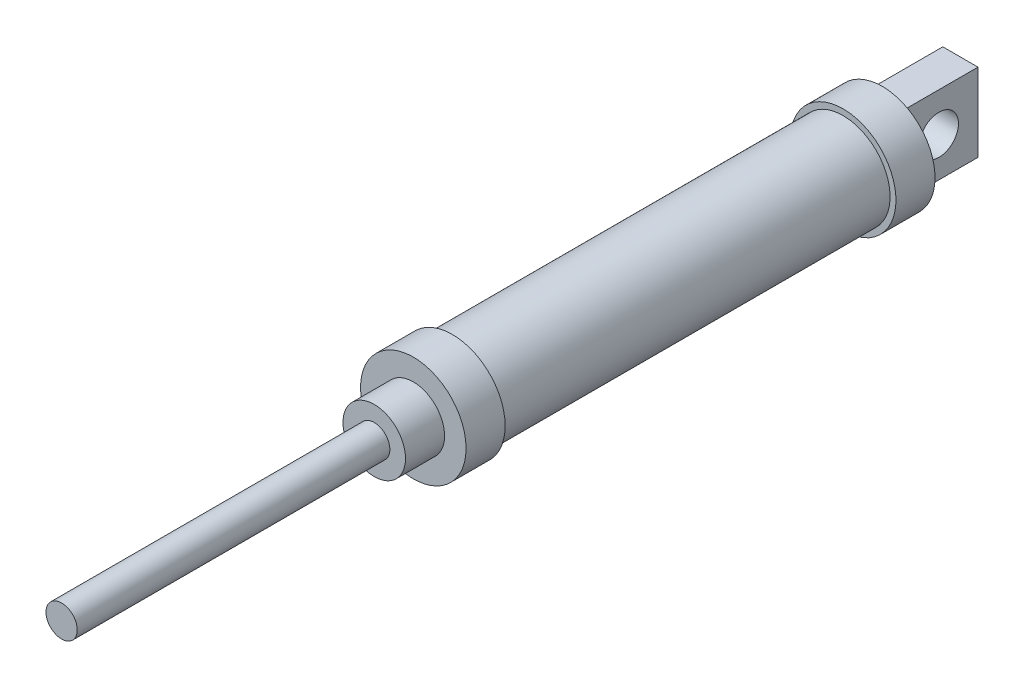
ISO-10303-21;
HEADER;
FILE_DESCRIPTION(('STEP AP214'),'2;1');
FILE_NAME('part.step','',(''),(''),'','','');
FILE_SCHEMA(('AUTOMOTIVE_DESIGN { 1 0 10303 214 1 1 1 1 }'));
ENDSEC;
DATA;
#1=APPLICATION_CONTEXT('core data for automotive mechanical design processes');
#2=APPLICATION_PROTOCOL_DEFINITION('international standard','automotive_design',2000,#1);
#3=PRODUCT_CONTEXT('',#1,'mechanical');
#4=PRODUCT('Part','Part','',(#3));
#5=PRODUCT_RELATED_PRODUCT_CATEGORY('part','',(#4));
#6=PRODUCT_DEFINITION_FORMATION('','',#4);
#7=PRODUCT_DEFINITION_CONTEXT('part definition',#1,'design');
#8=PRODUCT_DEFINITION('design','',#6,#7);
#9=PRODUCT_DEFINITION_SHAPE('','',#8);
#10=(LENGTH_UNIT() NAMED_UNIT(*) SI_UNIT(.MILLI.,.METRE.));
#11=(NAMED_UNIT(*) PLANE_ANGLE_UNIT() SI_UNIT($,.RADIAN.));
#12=(NAMED_UNIT(*) SI_UNIT($,.STERADIAN.) SOLID_ANGLE_UNIT());
#13=UNCERTAINTY_MEASURE_WITH_UNIT(LENGTH_MEASURE(1.E-05),#10,'distance_accuracy_value','');
#14=(GEOMETRIC_REPRESENTATION_CONTEXT(3) GLOBAL_UNCERTAINTY_ASSIGNED_CONTEXT((#13)) GLOBAL_UNIT_ASSIGNED_CONTEXT((#10,
#11,#12)) REPRESENTATION_CONTEXT('',''));
#15=CARTESIAN_POINT('',(0.,0.,0.));
#16=DIRECTION('',(0.,0.,1.));
#17=DIRECTION('',(1.,0.,0.));
#18=AXIS2_PLACEMENT_3D('',#15,#16,#17);
#19=CARTESIAN_POINT('',(0.,0.,10.));
#20=DIRECTION('',(0.,0.,-1.));
#21=DIRECTION('',(-1.,0.,0.));
#22=AXIS2_PLACEMENT_3D('',#19,#20,#21);
#23=CYLINDRICAL_SURFACE('',#22,13.5);
#24=CARTESIAN_POINT('',(0.,0.,10.));
#25=DIRECTION('',(0.,0.,1.));
#26=DIRECTION('',(1.,0.,0.));
#27=AXIS2_PLACEMENT_3D('',#24,#25,#26);
#28=CIRCLE('',#27,13.5);
#29=CARTESIAN_POINT('',(13.5,0.,10.));
#30=VERTEX_POINT('',#29);
#31=EDGE_CURVE('E120',#30,#30,#28,.T.);
#32=ORIENTED_EDGE('',*,*,#31,.F.);
#33=EDGE_LOOP('',(#32));
#34=FACE_BOUND('',#33,.T.);
#35=CARTESIAN_POINT('',(0.,0.,0.));
#36=DIRECTION('',(0.,0.,1.));
#37=DIRECTION('',(1.,0.,0.));
#38=AXIS2_PLACEMENT_3D('',#35,#36,#37);
#39=CIRCLE('',#38,13.5);
#40=CARTESIAN_POINT('',(13.5,0.,0.));
#41=VERTEX_POINT('',#40);
#42=EDGE_CURVE('E117',#41,#41,#39,.T.);
#43=ORIENTED_EDGE('',*,*,#42,.T.);
#44=EDGE_LOOP('',(#43));
#45=FACE_BOUND('',#44,.T.);
#46=ADVANCED_FACE('F35',(#34,#45),#23,.T.);
#47=CARTESIAN_POINT('',(0.,0.,10.));
#48=DIRECTION('',(0.,0.,1.));
#49=DIRECTION('',(1.,0.,0.));
#50=AXIS2_PLACEMENT_3D('',#47,#48,#49);
#51=PLANE('',#50);
#52=CARTESIAN_POINT('',(0.,0.,10.));
#53=DIRECTION('',(0.,0.,1.));
#54=DIRECTION('',(1.,0.,0.));
#55=AXIS2_PLACEMENT_3D('',#52,#53,#54);
#56=CIRCLE('',#55,8.);
#57=CARTESIAN_POINT('',(8.,0.,10.));
#58=VERTEX_POINT('',#57);
#59=EDGE_CURVE('E114',#58,#58,#56,.T.);
#60=ORIENTED_EDGE('',*,*,#59,.F.);
#61=EDGE_LOOP('',(#60));
#62=FACE_BOUND('',#61,.T.);
#63=ORIENTED_EDGE('',*,*,#31,.T.);
#64=EDGE_LOOP('',(#63));
#65=FACE_BOUND('',#64,.T.);
#66=ADVANCED_FACE('F129',(#62,#65),#51,.T.);
#67=CARTESIAN_POINT('',(0.,0.,0.));
#68=DIRECTION('',(0.,0.,1.));
#69=DIRECTION('',(1.,0.,0.));
#70=AXIS2_PLACEMENT_3D('',#67,#68,#69);
#71=PLANE('',#70);
#72=CARTESIAN_POINT('',(0.,0.,0.));
#73=DIRECTION('',(0.,0.,-1.));
#74=DIRECTION('',(-1.,0.,0.));
#75=AXIS2_PLACEMENT_3D('',#72,#73,#74);
#76=CIRCLE('',#75,12.);
#77=CARTESIAN_POINT('',(-12.,0.,0.));
#78=VERTEX_POINT('',#77);
#79=EDGE_CURVE('E43',#78,#78,#76,.T.);
#80=ORIENTED_EDGE('',*,*,#79,.F.);
#81=EDGE_LOOP('',(#80));
#82=FACE_BOUND('',#81,.T.);
#83=ORIENTED_EDGE('',*,*,#42,.F.);
#84=EDGE_LOOP('',(#83));
#85=FACE_BOUND('',#84,.T.);
#86=ADVANCED_FACE('F126',(#82,#85),#71,.F.);
#87=CARTESIAN_POINT('',(0.,0.,20.));
#88=DIRECTION('',(0.,0.,-1.));
#89=DIRECTION('',(-1.,0.,0.));
#90=AXIS2_PLACEMENT_3D('',#87,#88,#89);
#91=CYLINDRICAL_SURFACE('',#90,8.);
#92=CARTESIAN_POINT('',(0.,0.,20.));
#93=DIRECTION('',(0.,0.,1.));
#94=DIRECTION('',(1.,0.,0.));
#95=AXIS2_PLACEMENT_3D('',#92,#93,#94);
#96=CIRCLE('',#95,8.);
#97=CARTESIAN_POINT('',(8.,0.,20.));
#98=VERTEX_POINT('',#97);
#99=EDGE_CURVE('E111',#98,#98,#96,.T.);
#100=ORIENTED_EDGE('',*,*,#99,.F.);
#101=EDGE_LOOP('',(#100));
#102=FACE_BOUND('',#101,.T.);
#103=ORIENTED_EDGE('',*,*,#59,.T.);
#104=EDGE_LOOP('',(#103));
#105=FACE_BOUND('',#104,.T.);
#106=ADVANCED_FACE('F128',(#102,#105),#91,.T.);
#107=CARTESIAN_POINT('',(0.,0.,20.));
#108=DIRECTION('',(0.,0.,1.));
#109=DIRECTION('',(1.,0.,0.));
#110=AXIS2_PLACEMENT_3D('',#107,#108,#109);
#111=PLANE('',#110);
#112=CARTESIAN_POINT('',(0.,0.,20.));
#113=DIRECTION('',(0.,0.,1.));
#114=DIRECTION('',(1.,0.,0.));
#115=AXIS2_PLACEMENT_3D('',#112,#113,#114);
#116=CIRCLE('',#115,4.);
#117=CARTESIAN_POINT('',(4.,0.,20.));
#118=VERTEX_POINT('',#117);
#119=EDGE_CURVE('E11',#118,#118,#116,.T.);
#120=ORIENTED_EDGE('',*,*,#119,.F.);
#121=EDGE_LOOP('',(#120));
#122=FACE_BOUND('',#121,.T.);
#123=ORIENTED_EDGE('',*,*,#99,.T.);
#124=EDGE_LOOP('',(#123));
#125=FACE_BOUND('',#124,.T.);
#126=ADVANCED_FACE('F135',(#122,#125),#111,.T.);
#127=CARTESIAN_POINT('',(0.,0.,-100.));
#128=DIRECTION('',(0.,0.,1.));
#129=DIRECTION('',(1.,0.,0.));
#130=AXIS2_PLACEMENT_3D('',#127,#128,#129);
#131=CYLINDRICAL_SURFACE('',#130,12.);
#132=CARTESIAN_POINT('',(0.,0.,-100.));
#133=DIRECTION('',(0.,0.,-1.));
#134=DIRECTION('',(-1.,0.,0.));
#135=AXIS2_PLACEMENT_3D('',#132,#133,#134);
#136=CIRCLE('',#135,12.);
#137=CARTESIAN_POINT('',(-12.,0.,-100.));
#138=VERTEX_POINT('',#137);
#139=EDGE_CURVE('E107',#138,#138,#136,.T.);
#140=ORIENTED_EDGE('',*,*,#139,.F.);
#141=EDGE_LOOP('',(#140));
#142=FACE_BOUND('',#141,.T.);
#143=ORIENTED_EDGE('',*,*,#79,.T.);
#144=EDGE_LOOP('',(#143));
#145=FACE_BOUND('',#144,.T.);
#146=ADVANCED_FACE('F168',(#142,#145),#131,.T.);
#147=CARTESIAN_POINT('',(0.,0.,-110.));
#148=DIRECTION('',(0.,0.,1.));
#149=DIRECTION('',(1.,0.,0.));
#150=AXIS2_PLACEMENT_3D('',#147,#148,#149);
#151=CYLINDRICAL_SURFACE('',#150,13.5);
#152=CARTESIAN_POINT('',(0.,0.,-110.));
#153=DIRECTION('',(0.,0.,-1.));
#154=DIRECTION('',(-1.,0.,0.));
#155=AXIS2_PLACEMENT_3D('',#152,#153,#154);
#156=CIRCLE('',#155,13.5);
#157=CARTESIAN_POINT('',(-13.5,0.,-110.));
#158=VERTEX_POINT('',#157);
#159=EDGE_CURVE('E100',#158,#158,#156,.T.);
#160=ORIENTED_EDGE('',*,*,#159,.F.);
#161=EDGE_LOOP('',(#160));
#162=FACE_BOUND('',#161,.T.);
#163=CARTESIAN_POINT('',(0.,0.,-100.));
#164=DIRECTION('',(0.,0.,-1.));
#165=DIRECTION('',(-1.,0.,0.));
#166=AXIS2_PLACEMENT_3D('',#163,#164,#165);
#167=CIRCLE('',#166,13.5);
#168=CARTESIAN_POINT('',(-13.5,0.,-100.));
#169=VERTEX_POINT('',#168);
#170=EDGE_CURVE('E97',#169,#169,#167,.T.);
#171=ORIENTED_EDGE('',*,*,#170,.T.);
#172=EDGE_LOOP('',(#171));
#173=FACE_BOUND('',#172,.T.);
#174=ADVANCED_FACE('F173',(#162,#173),#151,.T.);
#175=CARTESIAN_POINT('',(0.,0.,-110.));
#176=DIRECTION('',(0.,0.,-1.));
#177=DIRECTION('',(-1.,0.,0.));
#178=AXIS2_PLACEMENT_3D('',#175,#176,#177);
#179=PLANE('',#178);
#180=DIRECTION('',(0.,-1.,0.));
#181=VECTOR('',#180,1.);
#182=CARTESIAN_POINT('',(4.5,-10.,-110.));
#183=LINE('',#182,#181);
#184=CARTESIAN_POINT('',(4.5,10.,-110.));
#185=VERTEX_POINT('',#184);
#186=CARTESIAN_POINT('',(4.5,-10.,-110.));
#187=VERTEX_POINT('',#186);
#188=EDGE_CURVE('E51',#185,#187,#183,.T.);
#189=ORIENTED_EDGE('',*,*,#188,.F.);
#190=DIRECTION('',(1.,0.,0.));
#191=VECTOR('',#190,1.);
#192=CARTESIAN_POINT('',(-4.5,10.,-110.));
#193=LINE('',#192,#191);
#194=CARTESIAN_POINT('',(-4.5,10.,-110.));
#195=VERTEX_POINT('',#194);
#196=EDGE_CURVE('E55',#195,#185,#193,.T.);
#197=ORIENTED_EDGE('',*,*,#196,.F.);
#198=DIRECTION('',(0.,1.,0.));
#199=VECTOR('',#198,1.);
#200=CARTESIAN_POINT('',(-4.5,-10.,-110.));
#201=LINE('',#200,#199);
#202=CARTESIAN_POINT('',(-4.5,-10.,-110.));
#203=VERTEX_POINT('',#202);
#204=EDGE_CURVE('E302',#203,#195,#201,.T.);
#205=ORIENTED_EDGE('',*,*,#204,.F.);
#206=DIRECTION('',(-1.,0.,0.));
#207=VECTOR('',#206,1.);
#208=CARTESIAN_POINT('',(-4.5,-10.,-110.));
#209=LINE('',#208,#207);
#210=EDGE_CURVE('E300',#187,#203,#209,.T.);
#211=ORIENTED_EDGE('',*,*,#210,.F.);
#212=EDGE_LOOP('',(#189,#197,#205,#211));
#213=FACE_BOUND('',#212,.T.);
#214=ORIENTED_EDGE('',*,*,#159,.T.);
#215=EDGE_LOOP('',(#214));
#216=FACE_BOUND('',#215,.T.);
#217=ADVANCED_FACE('F183',(#213,#216),#179,.T.);
#218=CARTESIAN_POINT('',(0.,0.,-100.));
#219=DIRECTION('',(0.,0.,-1.));
#220=DIRECTION('',(-1.,0.,0.));
#221=AXIS2_PLACEMENT_3D('',#218,#219,#220);
#222=PLANE('',#221);
#223=ORIENTED_EDGE('',*,*,#139,.T.);
#224=EDGE_LOOP('',(#223));
#225=FACE_BOUND('',#224,.T.);
#226=ORIENTED_EDGE('',*,*,#170,.F.);
#227=EDGE_LOOP('',(#226));
#228=FACE_BOUND('',#227,.T.);
#229=ADVANCED_FACE('F191',(#225,#228),#222,.F.);
#230=CARTESIAN_POINT('',(4.5,-10.,-130.));
#231=DIRECTION('',(-1.,0.,0.));
#232=DIRECTION('',(0.,-1.,0.));
#233=AXIS2_PLACEMENT_3D('',#230,#231,#232);
#234=PLANE('',#233);
#235=CARTESIAN_POINT('',(4.5,0.,-120.));
#236=DIRECTION('',(1.,0.,0.));
#237=DIRECTION('',(0.,1.,0.));
#238=AXIS2_PLACEMENT_3D('',#235,#236,#237);
#239=CIRCLE('',#238,4.99999999999999);
#240=CARTESIAN_POINT('',(4.5,4.99999999999999,-120.));
#241=VERTEX_POINT('',#240);
#242=EDGE_CURVE('E291',#241,#241,#239,.T.);
#243=ORIENTED_EDGE('',*,*,#242,.F.);
#244=EDGE_LOOP('',(#243));
#245=FACE_BOUND('',#244,.T.);
#246=ORIENTED_EDGE('',*,*,#188,.T.);
#247=DIRECTION('',(0.,0.,1.));
#248=VECTOR('',#247,1.);
#249=CARTESIAN_POINT('',(4.5,-10.,-130.));
#250=LINE('',#249,#248);
#251=CARTESIAN_POINT('',(4.5,-10.,-130.));
#252=VERTEX_POINT('',#251);
#253=EDGE_CURVE('E80',#252,#187,#250,.T.);
#254=ORIENTED_EDGE('',*,*,#253,.F.);
#255=DIRECTION('',(0.,-1.,0.));
#256=VECTOR('',#255,1.);
#257=CARTESIAN_POINT('',(4.5,-10.,-130.));
#258=LINE('',#257,#256);
#259=CARTESIAN_POINT('',(4.5,10.,-130.));
#260=VERTEX_POINT('',#259);
#261=EDGE_CURVE('E86',#260,#252,#258,.T.);
#262=ORIENTED_EDGE('',*,*,#261,.F.);
#263=DIRECTION('',(0.,0.,1.));
#264=VECTOR('',#263,1.);
#265=CARTESIAN_POINT('',(4.5,10.,-130.));
#266=LINE('',#265,#264);
#267=EDGE_CURVE('E298',#260,#185,#266,.T.);
#268=ORIENTED_EDGE('',*,*,#267,.T.);
#269=EDGE_LOOP('',(#246,#254,#262,#268));
#270=FACE_BOUND('',#269,.T.);
#271=ADVANCED_FACE('F96',(#245,#270),#234,.F.);
#272=CARTESIAN_POINT('',(-4.5,-10.,-130.));
#273=DIRECTION('',(0.,1.,0.));
#274=DIRECTION('',(-1.,0.,0.));
#275=AXIS2_PLACEMENT_3D('',#272,#273,#274);
#276=PLANE('',#275);
#277=ORIENTED_EDGE('',*,*,#210,.T.);
#278=DIRECTION('',(0.,0.,1.));
#279=VECTOR('',#278,1.);
#280=CARTESIAN_POINT('',(-4.5,-10.,-130.));
#281=LINE('',#280,#279);
#282=CARTESIAN_POINT('',(-4.5,-10.,-130.));
#283=VERTEX_POINT('',#282);
#284=EDGE_CURVE('E82',#283,#203,#281,.T.);
#285=ORIENTED_EDGE('',*,*,#284,.F.);
#286=DIRECTION('',(-1.,0.,0.));
#287=VECTOR('',#286,1.);
#288=CARTESIAN_POINT('',(-4.5,-10.,-130.));
#289=LINE('',#288,#287);
#290=EDGE_CURVE('E75',#252,#283,#289,.T.);
#291=ORIENTED_EDGE('',*,*,#290,.F.);
#292=ORIENTED_EDGE('',*,*,#253,.T.);
#293=EDGE_LOOP('',(#277,#285,#291,#292));
#294=FACE_BOUND('',#293,.T.);
#295=ADVANCED_FACE('F78',(#294),#276,.F.);
#296=CARTESIAN_POINT('',(-4.5,-10.,-130.));
#297=DIRECTION('',(1.,0.,0.));
#298=DIRECTION('',(0.,0.,-1.));
#299=AXIS2_PLACEMENT_3D('',#296,#297,#298);
#300=PLANE('',#299);
#301=CARTESIAN_POINT('',(-4.5,0.,-120.));
#302=DIRECTION('',(1.,0.,0.));
#303=DIRECTION('',(0.,0.,-1.));
#304=AXIS2_PLACEMENT_3D('',#301,#302,#303);
#305=CIRCLE('',#304,4.99999999999999);
#306=CARTESIAN_POINT('',(-4.5,0.,-125.));
#307=VERTEX_POINT('',#306);
#308=EDGE_CURVE('E38',#307,#307,#305,.T.);
#309=ORIENTED_EDGE('',*,*,#308,.T.);
#310=EDGE_LOOP('',(#309));
#311=FACE_BOUND('',#310,.T.);
#312=ORIENTED_EDGE('',*,*,#204,.T.);
#313=DIRECTION('',(0.,0.,1.));
#314=VECTOR('',#313,1.);
#315=CARTESIAN_POINT('',(-4.5,10.,-130.));
#316=LINE('',#315,#314);
#317=CARTESIAN_POINT('',(-4.5,10.,-130.));
#318=VERTEX_POINT('',#317);
#319=EDGE_CURVE('E102',#318,#195,#316,.T.);
#320=ORIENTED_EDGE('',*,*,#319,.F.);
#321=DIRECTION('',(0.,1.,0.));
#322=VECTOR('',#321,1.);
#323=CARTESIAN_POINT('',(-4.5,-10.,-130.));
#324=LINE('',#323,#322);
#325=EDGE_CURVE('E85',#283,#318,#324,.T.);
#326=ORIENTED_EDGE('',*,*,#325,.F.);
#327=ORIENTED_EDGE('',*,*,#284,.T.);
#328=EDGE_LOOP('',(#312,#320,#326,#327));
#329=FACE_BOUND('',#328,.T.);
#330=ADVANCED_FACE('F213',(#311,#329),#300,.F.);
#331=CARTESIAN_POINT('',(-4.5,10.,-130.));
#332=DIRECTION('',(0.,-1.,0.));
#333=DIRECTION('',(0.,0.,-1.));
#334=AXIS2_PLACEMENT_3D('',#331,#332,#333);
#335=PLANE('',#334);
#336=ORIENTED_EDGE('',*,*,#196,.T.);
#337=ORIENTED_EDGE('',*,*,#267,.F.);
#338=DIRECTION('',(1.,0.,0.));
#339=VECTOR('',#338,1.);
#340=CARTESIAN_POINT('',(-4.5,10.,-130.));
#341=LINE('',#340,#339);
#342=EDGE_CURVE('E91',#318,#260,#341,.T.);
#343=ORIENTED_EDGE('',*,*,#342,.F.);
#344=ORIENTED_EDGE('',*,*,#319,.T.);
#345=EDGE_LOOP('',(#336,#337,#343,#344));
#346=FACE_BOUND('',#345,.T.);
#347=ADVANCED_FACE('F220',(#346),#335,.F.);
#348=CARTESIAN_POINT('',(0.,0.,-130.));
#349=DIRECTION('',(0.,0.,-1.));
#350=DIRECTION('',(-1.,0.,0.));
#351=AXIS2_PLACEMENT_3D('',#348,#349,#350);
#352=PLANE('',#351);
#353=ORIENTED_EDGE('',*,*,#261,.T.);
#354=ORIENTED_EDGE('',*,*,#290,.T.);
#355=ORIENTED_EDGE('',*,*,#325,.T.);
#356=ORIENTED_EDGE('',*,*,#342,.T.);
#357=EDGE_LOOP('',(#353,#354,#355,#356));
#358=FACE_BOUND('',#357,.T.);
#359=ADVANCED_FACE('F89',(#358),#352,.T.);
#360=CARTESIAN_POINT('',(-15.5,0.,-120.));
#361=DIRECTION('',(1.,0.,0.));
#362=DIRECTION('',(0.,1.,0.));
#363=AXIS2_PLACEMENT_3D('',#360,#361,#362);
#364=CYLINDRICAL_SURFACE('',#363,4.99999999999999);
#365=ORIENTED_EDGE('',*,*,#242,.T.);
#366=EDGE_LOOP('',(#365));
#367=FACE_BOUND('',#366,.T.);
#368=ORIENTED_EDGE('',*,*,#308,.F.);
#369=EDGE_LOOP('',(#368));
#370=FACE_BOUND('',#369,.T.);
#371=ADVANCED_FACE('F234',(#367,#370),#364,.F.);
#372=CARTESIAN_POINT('',(0.,0.,100.));
#373=DIRECTION('',(0.,0.,-1.));
#374=DIRECTION('',(-1.,0.,0.));
#375=AXIS2_PLACEMENT_3D('',#372,#373,#374);
#376=CYLINDRICAL_SURFACE('',#375,4.);
#377=CARTESIAN_POINT('',(0.,0.,100.));
#378=DIRECTION('',(0.,0.,1.));
#379=DIRECTION('',(1.,0.,0.));
#380=AXIS2_PLACEMENT_3D('',#377,#378,#379);
#381=CIRCLE('',#380,4.);
#382=CARTESIAN_POINT('',(4.,0.,100.));
#383=VERTEX_POINT('',#382);
#384=EDGE_CURVE('E290',#383,#383,#381,.T.);
#385=ORIENTED_EDGE('',*,*,#384,.F.);
#386=EDGE_LOOP('',(#385));
#387=FACE_BOUND('',#386,.T.);
#388=ORIENTED_EDGE('',*,*,#119,.T.);
#389=EDGE_LOOP('',(#388));
#390=FACE_BOUND('',#389,.T.);
#391=ADVANCED_FACE('F257',(#387,#390),#376,.T.);
#392=CARTESIAN_POINT('',(0.,0.,100.));
#393=DIRECTION('',(0.,0.,1.));
#394=DIRECTION('',(1.,0.,0.));
#395=AXIS2_PLACEMENT_3D('',#392,#393,#394);
#396=PLANE('',#395);
#397=ORIENTED_EDGE('',*,*,#384,.T.);
#398=EDGE_LOOP('',(#397));
#399=FACE_BOUND('',#398,.T.);
#400=ADVANCED_FACE('F274',(#399),#396,.T.);
#401=CLOSED_SHELL('',(#46,#66,#86,#106,#126,#146,#174,#217,#229,#271,#295,#330,#347,#359,#371,
#391,#400));
#402=MANIFOLD_SOLID_BREP('B2',#401);
#403=ADVANCED_BREP_SHAPE_REPRESENTATION('',(#18,#402),#14);
#404=SHAPE_DEFINITION_REPRESENTATION(#9,#403);
ENDSEC;
END-ISO-10303-21;
